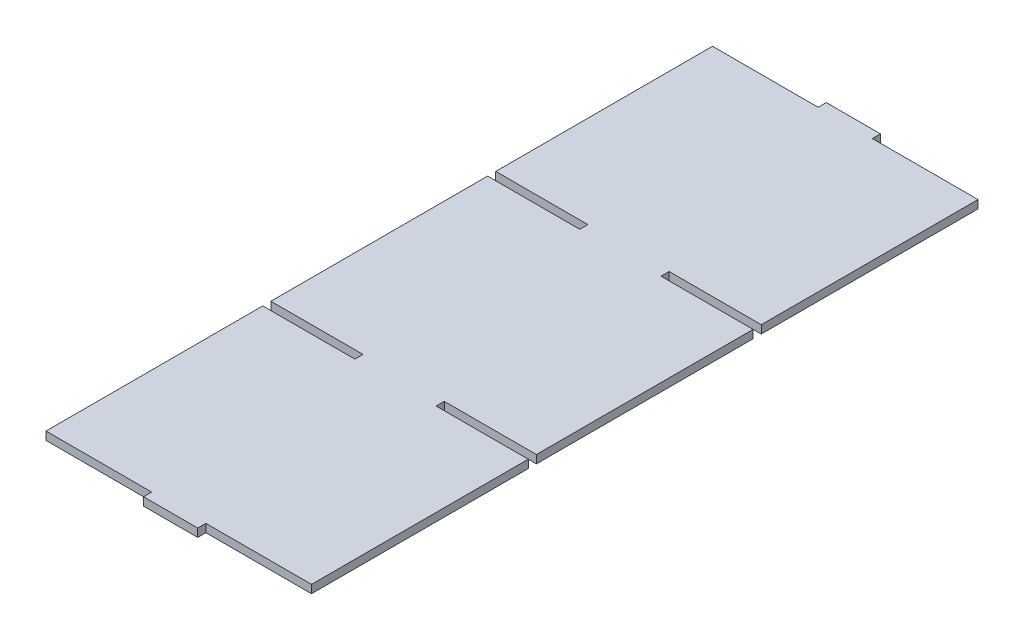
ISO-10303-21;
HEADER;
FILE_DESCRIPTION(('STEP AP214'),'2;1');
FILE_NAME('part.step','',(''),(''),'','','');
FILE_SCHEMA(('AUTOMOTIVE_DESIGN { 1 0 10303 214 1 1 1 1 }'));
ENDSEC;
DATA;
#1=APPLICATION_CONTEXT('core data for automotive mechanical design processes');
#2=APPLICATION_PROTOCOL_DEFINITION('international standard','automotive_design',2000,#1);
#3=PRODUCT_CONTEXT('',#1,'mechanical');
#4=PRODUCT('Part','Part','',(#3));
#5=PRODUCT_RELATED_PRODUCT_CATEGORY('part','',(#4));
#6=PRODUCT_DEFINITION_FORMATION('','',#4);
#7=PRODUCT_DEFINITION_CONTEXT('part definition',#1,'design');
#8=PRODUCT_DEFINITION('design','',#6,#7);
#9=PRODUCT_DEFINITION_SHAPE('','',#8);
#10=(LENGTH_UNIT() NAMED_UNIT(*) SI_UNIT(.MILLI.,.METRE.));
#11=(NAMED_UNIT(*) PLANE_ANGLE_UNIT() SI_UNIT($,.RADIAN.));
#12=(NAMED_UNIT(*) SI_UNIT($,.STERADIAN.) SOLID_ANGLE_UNIT());
#13=UNCERTAINTY_MEASURE_WITH_UNIT(LENGTH_MEASURE(1.E-05),#10,'distance_accuracy_value','');
#14=(GEOMETRIC_REPRESENTATION_CONTEXT(3) GLOBAL_UNCERTAINTY_ASSIGNED_CONTEXT((#13)) GLOBAL_UNIT_ASSIGNED_CONTEXT((#10,
#11,#12)) REPRESENTATION_CONTEXT('',''));
#15=CARTESIAN_POINT('',(0.,0.,0.));
#16=DIRECTION('',(0.,0.,1.));
#17=DIRECTION('',(1.,0.,0.));
#18=AXIS2_PLACEMENT_3D('',#15,#16,#17);
#19=CARTESIAN_POINT('',(25.,3.,-83.));
#20=DIRECTION('',(0.,0.,-1.));
#21=DIRECTION('',(-1.,0.,0.));
#22=AXIS2_PLACEMENT_3D('',#19,#20,#21);
#23=PLANE('',#22);
#24=DIRECTION('',(1.,0.,0.));
#25=VECTOR('',#24,1.);
#26=CARTESIAN_POINT('',(25.,0.,-83.));
#27=LINE('',#26,#25);
#28=CARTESIAN_POINT('',(25.,0.,-83.));
#29=VERTEX_POINT('',#28);
#30=CARTESIAN_POINT('',(59.,0.,-83.));
#31=VERTEX_POINT('',#30);
#32=EDGE_CURVE('E254',#29,#31,#27,.T.);
#33=ORIENTED_EDGE('',*,*,#32,.F.);
#34=DIRECTION('',(0.,-1.,0.));
#35=VECTOR('',#34,1.);
#36=CARTESIAN_POINT('',(25.,3.,-83.));
#37=LINE('',#36,#35);
#38=CARTESIAN_POINT('',(25.,3.,-83.));
#39=VERTEX_POINT('',#38);
#40=EDGE_CURVE('E11',#39,#29,#37,.T.);
#41=ORIENTED_EDGE('',*,*,#40,.F.);
#42=DIRECTION('',(1.,0.,0.));
#43=VECTOR('',#42,1.);
#44=CARTESIAN_POINT('',(25.,3.,-83.));
#45=LINE('',#44,#43);
#46=CARTESIAN_POINT('',(59.,3.,-83.));
#47=VERTEX_POINT('',#46);
#48=EDGE_CURVE('E334',#39,#47,#45,.T.);
#49=ORIENTED_EDGE('',*,*,#48,.T.);
#50=DIRECTION('',(0.,-1.,0.));
#51=VECTOR('',#50,1.);
#52=CARTESIAN_POINT('',(59.,3.,-83.));
#53=LINE('',#52,#51);
#54=EDGE_CURVE('E40',#47,#31,#53,.T.);
#55=ORIENTED_EDGE('',*,*,#54,.T.);
#56=EDGE_LOOP('',(#33,#41,#49,#55));
#57=FACE_BOUND('',#56,.T.);
#58=ADVANCED_FACE('F37',(#57),#23,.T.);
#59=CARTESIAN_POINT('',(25.,3.,-86.));
#60=DIRECTION('',(1.,0.,0.));
#61=DIRECTION('',(0.,0.,-1.));
#62=AXIS2_PLACEMENT_3D('',#59,#60,#61);
#63=PLANE('',#62);
#64=DIRECTION('',(0.,0.,1.));
#65=VECTOR('',#64,1.);
#66=CARTESIAN_POINT('',(25.,0.,-86.));
#67=LINE('',#66,#65);
#68=CARTESIAN_POINT('',(25.,0.,-86.));
#69=VERTEX_POINT('',#68);
#70=EDGE_CURVE('E332',#69,#29,#67,.T.);
#71=ORIENTED_EDGE('',*,*,#70,.F.);
#72=DIRECTION('',(0.,-1.,0.));
#73=VECTOR('',#72,1.);
#74=CARTESIAN_POINT('',(25.,3.,-86.));
#75=LINE('',#74,#73);
#76=CARTESIAN_POINT('',(25.,3.,-86.));
#77=VERTEX_POINT('',#76);
#78=EDGE_CURVE('E46',#77,#69,#75,.T.);
#79=ORIENTED_EDGE('',*,*,#78,.F.);
#80=DIRECTION('',(0.,0.,1.));
#81=VECTOR('',#80,1.);
#82=CARTESIAN_POINT('',(25.,3.,-86.));
#83=LINE('',#82,#81);
#84=EDGE_CURVE('E244',#77,#39,#83,.T.);
#85=ORIENTED_EDGE('',*,*,#84,.T.);
#86=ORIENTED_EDGE('',*,*,#40,.T.);
#87=EDGE_LOOP('',(#71,#79,#85,#86));
#88=FACE_BOUND('',#87,.T.);
#89=ADVANCED_FACE('F386',(#88),#63,.T.);
#90=CARTESIAN_POINT('',(59.,3.,-86.));
#91=DIRECTION('',(0.,0.,1.));
#92=DIRECTION('',(1.,0.,0.));
#93=AXIS2_PLACEMENT_3D('',#90,#91,#92);
#94=PLANE('',#93);
#95=DIRECTION('',(-1.,0.,0.));
#96=VECTOR('',#95,1.);
#97=CARTESIAN_POINT('',(59.,0.,-86.));
#98=LINE('',#97,#96);
#99=CARTESIAN_POINT('',(59.,0.,-86.));
#100=VERTEX_POINT('',#99);
#101=EDGE_CURVE('E231',#100,#69,#98,.T.);
#102=ORIENTED_EDGE('',*,*,#101,.F.);
#103=DIRECTION('',(0.,-1.,0.));
#104=VECTOR('',#103,1.);
#105=CARTESIAN_POINT('',(59.,3.,-86.));
#106=LINE('',#105,#104);
#107=CARTESIAN_POINT('',(59.,3.,-86.));
#108=VERTEX_POINT('',#107);
#109=EDGE_CURVE('E226',#108,#100,#106,.T.);
#110=ORIENTED_EDGE('',*,*,#109,.F.);
#111=DIRECTION('',(-1.,0.,0.));
#112=VECTOR('',#111,1.);
#113=CARTESIAN_POINT('',(59.,3.,-86.));
#114=LINE('',#113,#112);
#115=EDGE_CURVE('E229',#108,#77,#114,.T.);
#116=ORIENTED_EDGE('',*,*,#115,.T.);
#117=ORIENTED_EDGE('',*,*,#78,.T.);
#118=EDGE_LOOP('',(#102,#110,#116,#117));
#119=FACE_BOUND('',#118,.T.);
#120=ADVANCED_FACE('F228',(#119),#94,.T.);
#121=CARTESIAN_POINT('',(59.,3.,-166.));
#122=DIRECTION('',(1.,0.,0.));
#123=DIRECTION('',(0.,0.,-1.));
#124=AXIS2_PLACEMENT_3D('',#121,#122,#123);
#125=PLANE('',#124);
#126=DIRECTION('',(0.,0.,1.));
#127=VECTOR('',#126,1.);
#128=CARTESIAN_POINT('',(59.,0.,-166.));
#129=LINE('',#128,#127);
#130=CARTESIAN_POINT('',(59.,0.,-166.));
#131=VERTEX_POINT('',#130);
#132=EDGE_CURVE('E329',#131,#100,#129,.T.);
#133=ORIENTED_EDGE('',*,*,#132,.F.);
#134=DIRECTION('',(0.,-1.,0.));
#135=VECTOR('',#134,1.);
#136=CARTESIAN_POINT('',(59.,3.,-166.));
#137=LINE('',#136,#135);
#138=CARTESIAN_POINT('',(59.,3.,-166.));
#139=VERTEX_POINT('',#138);
#140=EDGE_CURVE('E236',#139,#131,#137,.T.);
#141=ORIENTED_EDGE('',*,*,#140,.F.);
#142=DIRECTION('',(0.,0.,1.));
#143=VECTOR('',#142,1.);
#144=CARTESIAN_POINT('',(59.,3.,-166.));
#145=LINE('',#144,#143);
#146=EDGE_CURVE('E242',#139,#108,#145,.T.);
#147=ORIENTED_EDGE('',*,*,#146,.T.);
#148=ORIENTED_EDGE('',*,*,#109,.T.);
#149=EDGE_LOOP('',(#133,#141,#147,#148));
#150=FACE_BOUND('',#149,.T.);
#151=ADVANCED_FACE('F246',(#150),#125,.T.);
#152=CARTESIAN_POINT('',(25.,3.,-166.));
#153=DIRECTION('',(0.,0.,-1.));
#154=DIRECTION('',(-1.,0.,0.));
#155=AXIS2_PLACEMENT_3D('',#152,#153,#154);
#156=PLANE('',#155);
#157=DIRECTION('',(1.,0.,0.));
#158=VECTOR('',#157,1.);
#159=CARTESIAN_POINT('',(25.,0.,-166.));
#160=LINE('',#159,#158);
#161=CARTESIAN_POINT('',(25.,0.,-166.));
#162=VERTEX_POINT('',#161);
#163=EDGE_CURVE('E326',#162,#131,#160,.T.);
#164=ORIENTED_EDGE('',*,*,#163,.F.);
#165=DIRECTION('',(0.,-1.,0.));
#166=VECTOR('',#165,1.);
#167=CARTESIAN_POINT('',(25.,3.,-166.));
#168=LINE('',#167,#166);
#169=CARTESIAN_POINT('',(25.,3.,-166.));
#170=VERTEX_POINT('',#169);
#171=EDGE_CURVE('E338',#170,#162,#168,.T.);
#172=ORIENTED_EDGE('',*,*,#171,.F.);
#173=DIRECTION('',(1.,0.,0.));
#174=VECTOR('',#173,1.);
#175=CARTESIAN_POINT('',(25.,3.,-166.));
#176=LINE('',#175,#174);
#177=EDGE_CURVE('E247',#170,#139,#176,.T.);
#178=ORIENTED_EDGE('',*,*,#177,.T.);
#179=ORIENTED_EDGE('',*,*,#140,.T.);
#180=EDGE_LOOP('',(#164,#172,#178,#179));
#181=FACE_BOUND('',#180,.T.);
#182=ADVANCED_FACE('F399',(#181),#156,.T.);
#183=CARTESIAN_POINT('',(25.,3.,-169.));
#184=DIRECTION('',(1.,0.,0.));
#185=DIRECTION('',(0.,0.,-1.));
#186=AXIS2_PLACEMENT_3D('',#183,#184,#185);
#187=PLANE('',#186);
#188=DIRECTION('',(0.,0.,1.));
#189=VECTOR('',#188,1.);
#190=CARTESIAN_POINT('',(25.,0.,-169.));
#191=LINE('',#190,#189);
#192=CARTESIAN_POINT('',(25.,0.,-169.));
#193=VERTEX_POINT('',#192);
#194=EDGE_CURVE('E323',#193,#162,#191,.T.);
#195=ORIENTED_EDGE('',*,*,#194,.F.);
#196=DIRECTION('',(0.,-1.,0.));
#197=VECTOR('',#196,1.);
#198=CARTESIAN_POINT('',(25.,3.,-169.));
#199=LINE('',#198,#197);
#200=CARTESIAN_POINT('',(25.,3.,-169.));
#201=VERTEX_POINT('',#200);
#202=EDGE_CURVE('E340',#201,#193,#199,.T.);
#203=ORIENTED_EDGE('',*,*,#202,.F.);
#204=DIRECTION('',(0.,0.,1.));
#205=VECTOR('',#204,1.);
#206=CARTESIAN_POINT('',(25.,3.,-169.));
#207=LINE('',#206,#205);
#208=EDGE_CURVE('E249',#201,#170,#207,.T.);
#209=ORIENTED_EDGE('',*,*,#208,.T.);
#210=ORIENTED_EDGE('',*,*,#171,.T.);
#211=EDGE_LOOP('',(#195,#203,#209,#210));
#212=FACE_BOUND('',#211,.T.);
#213=ADVANCED_FACE('F402',(#212),#187,.T.);
#214=CARTESIAN_POINT('',(59.,3.,-169.));
#215=DIRECTION('',(0.,0.,1.));
#216=DIRECTION('',(1.,0.,0.));
#217=AXIS2_PLACEMENT_3D('',#214,#215,#216);
#218=PLANE('',#217);
#219=DIRECTION('',(-1.,0.,0.));
#220=VECTOR('',#219,1.);
#221=CARTESIAN_POINT('',(59.,0.,-169.));
#222=LINE('',#221,#220);
#223=CARTESIAN_POINT('',(59.,0.,-169.));
#224=VERTEX_POINT('',#223);
#225=EDGE_CURVE('E320',#224,#193,#222,.T.);
#226=ORIENTED_EDGE('',*,*,#225,.F.);
#227=DIRECTION('',(0.,-1.,0.));
#228=VECTOR('',#227,1.);
#229=CARTESIAN_POINT('',(59.,3.,-169.));
#230=LINE('',#229,#228);
#231=CARTESIAN_POINT('',(59.,3.,-169.));
#232=VERTEX_POINT('',#231);
#233=EDGE_CURVE('E342',#232,#224,#230,.T.);
#234=ORIENTED_EDGE('',*,*,#233,.F.);
#235=DIRECTION('',(-1.,0.,0.));
#236=VECTOR('',#235,1.);
#237=CARTESIAN_POINT('',(59.,3.,-169.));
#238=LINE('',#237,#236);
#239=EDGE_CURVE('E807',#232,#201,#238,.T.);
#240=ORIENTED_EDGE('',*,*,#239,.T.);
#241=ORIENTED_EDGE('',*,*,#202,.T.);
#242=EDGE_LOOP('',(#226,#234,#240,#241));
#243=FACE_BOUND('',#242,.T.);
#244=ADVANCED_FACE('F406',(#243),#218,.T.);
#245=CARTESIAN_POINT('',(59.,3.,-249.));
#246=DIRECTION('',(1.,0.,0.));
#247=DIRECTION('',(0.,0.,-1.));
#248=AXIS2_PLACEMENT_3D('',#245,#246,#247);
#249=PLANE('',#248);
#250=DIRECTION('',(0.,0.,1.));
#251=VECTOR('',#250,1.);
#252=CARTESIAN_POINT('',(59.,0.,-249.));
#253=LINE('',#252,#251);
#254=CARTESIAN_POINT('',(59.,0.,-249.));
#255=VERTEX_POINT('',#254);
#256=EDGE_CURVE('E317',#255,#224,#253,.T.);
#257=ORIENTED_EDGE('',*,*,#256,.F.);
#258=DIRECTION('',(0.,-1.,0.));
#259=VECTOR('',#258,1.);
#260=CARTESIAN_POINT('',(59.,3.,-249.));
#261=LINE('',#260,#259);
#262=CARTESIAN_POINT('',(59.,3.,-249.));
#263=VERTEX_POINT('',#262);
#264=EDGE_CURVE('E344',#263,#255,#261,.T.);
#265=ORIENTED_EDGE('',*,*,#264,.F.);
#266=DIRECTION('',(0.,0.,1.));
#267=VECTOR('',#266,1.);
#268=CARTESIAN_POINT('',(59.,3.,-249.));
#269=LINE('',#268,#267);
#270=EDGE_CURVE('E803',#263,#232,#269,.T.);
#271=ORIENTED_EDGE('',*,*,#270,.T.);
#272=ORIENTED_EDGE('',*,*,#233,.T.);
#273=EDGE_LOOP('',(#257,#265,#271,#272));
#274=FACE_BOUND('',#273,.T.);
#275=ADVANCED_FACE('F410',(#274),#249,.T.);
#276=CARTESIAN_POINT('',(20.,3.,-249.));
#277=DIRECTION('',(0.,0.,-1.));
#278=DIRECTION('',(-1.,0.,0.));
#279=AXIS2_PLACEMENT_3D('',#276,#277,#278);
#280=PLANE('',#279);
#281=DIRECTION('',(1.,0.,0.));
#282=VECTOR('',#281,1.);
#283=CARTESIAN_POINT('',(20.,0.,-249.));
#284=LINE('',#283,#282);
#285=CARTESIAN_POINT('',(20.,0.,-249.));
#286=VERTEX_POINT('',#285);
#287=EDGE_CURVE('E314',#286,#255,#284,.T.);
#288=ORIENTED_EDGE('',*,*,#287,.F.);
#289=DIRECTION('',(0.,-1.,0.));
#290=VECTOR('',#289,1.);
#291=CARTESIAN_POINT('',(20.,3.,-249.));
#292=LINE('',#291,#290);
#293=CARTESIAN_POINT('',(20.,3.,-249.));
#294=VERTEX_POINT('',#293);
#295=EDGE_CURVE('E346',#294,#286,#292,.T.);
#296=ORIENTED_EDGE('',*,*,#295,.F.);
#297=DIRECTION('',(1.,0.,0.));
#298=VECTOR('',#297,1.);
#299=CARTESIAN_POINT('',(20.,3.,-249.));
#300=LINE('',#299,#298);
#301=EDGE_CURVE('E814',#294,#263,#300,.T.);
#302=ORIENTED_EDGE('',*,*,#301,.T.);
#303=ORIENTED_EDGE('',*,*,#264,.T.);
#304=EDGE_LOOP('',(#288,#296,#302,#303));
#305=FACE_BOUND('',#304,.T.);
#306=ADVANCED_FACE('F414',(#305),#280,.T.);
#307=CARTESIAN_POINT('',(20.,3.,-252.));
#308=DIRECTION('',(1.,0.,0.));
#309=DIRECTION('',(0.,0.,-1.));
#310=AXIS2_PLACEMENT_3D('',#307,#308,#309);
#311=PLANE('',#310);
#312=DIRECTION('',(0.,0.,1.));
#313=VECTOR('',#312,1.);
#314=CARTESIAN_POINT('',(20.,0.,-252.));
#315=LINE('',#314,#313);
#316=CARTESIAN_POINT('',(20.,0.,-252.));
#317=VERTEX_POINT('',#316);
#318=EDGE_CURVE('E311',#317,#286,#315,.T.);
#319=ORIENTED_EDGE('',*,*,#318,.F.);
#320=DIRECTION('',(0.,-1.,0.));
#321=VECTOR('',#320,1.);
#322=CARTESIAN_POINT('',(20.,3.,-252.));
#323=LINE('',#322,#321);
#324=CARTESIAN_POINT('',(20.,3.,-252.));
#325=VERTEX_POINT('',#324);
#326=EDGE_CURVE('E348',#325,#317,#323,.T.);
#327=ORIENTED_EDGE('',*,*,#326,.F.);
#328=DIRECTION('',(0.,0.,1.));
#329=VECTOR('',#328,1.);
#330=CARTESIAN_POINT('',(20.,3.,-252.));
#331=LINE('',#330,#329);
#332=EDGE_CURVE('E796',#325,#294,#331,.T.);
#333=ORIENTED_EDGE('',*,*,#332,.T.);
#334=ORIENTED_EDGE('',*,*,#295,.T.);
#335=EDGE_LOOP('',(#319,#327,#333,#334));
#336=FACE_BOUND('',#335,.T.);
#337=ADVANCED_FACE('F418',(#336),#311,.T.);
#338=CARTESIAN_POINT('',(0.,3.,-252.));
#339=DIRECTION('',(0.,0.,-1.));
#340=DIRECTION('',(-1.,0.,0.));
#341=AXIS2_PLACEMENT_3D('',#338,#339,#340);
#342=PLANE('',#341);
#343=DIRECTION('',(1.,0.,0.));
#344=VECTOR('',#343,1.);
#345=CARTESIAN_POINT('',(0.,0.,-252.));
#346=LINE('',#345,#344);
#347=CARTESIAN_POINT('',(0.,0.,-252.));
#348=VERTEX_POINT('',#347);
#349=EDGE_CURVE('E308',#348,#317,#346,.T.);
#350=ORIENTED_EDGE('',*,*,#349,.F.);
#351=DIRECTION('',(0.,-1.,0.));
#352=VECTOR('',#351,1.);
#353=CARTESIAN_POINT('',(0.,3.,-252.));
#354=LINE('',#353,#352);
#355=CARTESIAN_POINT('',(0.,3.,-252.));
#356=VERTEX_POINT('',#355);
#357=EDGE_CURVE('E350',#356,#348,#354,.T.);
#358=ORIENTED_EDGE('',*,*,#357,.F.);
#359=DIRECTION('',(1.,0.,0.));
#360=VECTOR('',#359,1.);
#361=CARTESIAN_POINT('',(0.,3.,-252.));
#362=LINE('',#361,#360);
#363=EDGE_CURVE('E792',#356,#325,#362,.T.);
#364=ORIENTED_EDGE('',*,*,#363,.T.);
#365=ORIENTED_EDGE('',*,*,#326,.T.);
#366=EDGE_LOOP('',(#350,#358,#364,#365));
#367=FACE_BOUND('',#366,.T.);
#368=ADVANCED_FACE('F422',(#367),#342,.T.);
#369=CARTESIAN_POINT('',(0.,3.,-249.));
#370=DIRECTION('',(-1.,0.,0.));
#371=DIRECTION('',(0.,0.,1.));
#372=AXIS2_PLACEMENT_3D('',#369,#370,#371);
#373=PLANE('',#372);
#374=DIRECTION('',(0.,0.,-1.));
#375=VECTOR('',#374,1.);
#376=CARTESIAN_POINT('',(0.,0.,-249.));
#377=LINE('',#376,#375);
#378=CARTESIAN_POINT('',(0.,0.,-249.));
#379=VERTEX_POINT('',#378);
#380=EDGE_CURVE('E305',#379,#348,#377,.T.);
#381=ORIENTED_EDGE('',*,*,#380,.F.);
#382=DIRECTION('',(0.,-1.,0.));
#383=VECTOR('',#382,1.);
#384=CARTESIAN_POINT('',(0.,3.,-249.));
#385=LINE('',#384,#383);
#386=CARTESIAN_POINT('',(0.,3.,-249.));
#387=VERTEX_POINT('',#386);
#388=EDGE_CURVE('E352',#387,#379,#385,.T.);
#389=ORIENTED_EDGE('',*,*,#388,.F.);
#390=DIRECTION('',(0.,0.,-1.));
#391=VECTOR('',#390,1.);
#392=CARTESIAN_POINT('',(0.,3.,-249.));
#393=LINE('',#392,#391);
#394=EDGE_CURVE('E818',#387,#356,#393,.T.);
#395=ORIENTED_EDGE('',*,*,#394,.T.);
#396=ORIENTED_EDGE('',*,*,#357,.T.);
#397=EDGE_LOOP('',(#381,#389,#395,#396));
#398=FACE_BOUND('',#397,.T.);
#399=ADVANCED_FACE('F426',(#398),#373,.T.);
#400=CARTESIAN_POINT('',(-39.,3.,-249.));
#401=DIRECTION('',(0.,0.,-1.));
#402=DIRECTION('',(-1.,0.,0.));
#403=AXIS2_PLACEMENT_3D('',#400,#401,#402);
#404=PLANE('',#403);
#405=DIRECTION('',(1.,0.,0.));
#406=VECTOR('',#405,1.);
#407=CARTESIAN_POINT('',(-39.,0.,-249.));
#408=LINE('',#407,#406);
#409=CARTESIAN_POINT('',(-39.,0.,-249.));
#410=VERTEX_POINT('',#409);
#411=EDGE_CURVE('E302',#410,#379,#408,.T.);
#412=ORIENTED_EDGE('',*,*,#411,.F.);
#413=DIRECTION('',(0.,-1.,0.));
#414=VECTOR('',#413,1.);
#415=CARTESIAN_POINT('',(-39.,3.,-249.));
#416=LINE('',#415,#414);
#417=CARTESIAN_POINT('',(-39.,3.,-249.));
#418=VERTEX_POINT('',#417);
#419=EDGE_CURVE('E354',#418,#410,#416,.T.);
#420=ORIENTED_EDGE('',*,*,#419,.F.);
#421=DIRECTION('',(1.,0.,0.));
#422=VECTOR('',#421,1.);
#423=CARTESIAN_POINT('',(-39.,3.,-249.));
#424=LINE('',#423,#422);
#425=EDGE_CURVE('E785',#418,#387,#424,.T.);
#426=ORIENTED_EDGE('',*,*,#425,.T.);
#427=ORIENTED_EDGE('',*,*,#388,.T.);
#428=EDGE_LOOP('',(#412,#420,#426,#427));
#429=FACE_BOUND('',#428,.T.);
#430=ADVANCED_FACE('F430',(#429),#404,.T.);
#431=CARTESIAN_POINT('',(-39.,3.,-169.));
#432=DIRECTION('',(-1.,0.,0.));
#433=DIRECTION('',(0.,0.,1.));
#434=AXIS2_PLACEMENT_3D('',#431,#432,#433);
#435=PLANE('',#434);
#436=DIRECTION('',(0.,0.,-1.));
#437=VECTOR('',#436,1.);
#438=CARTESIAN_POINT('',(-39.,0.,-169.));
#439=LINE('',#438,#437);
#440=CARTESIAN_POINT('',(-39.,0.,-169.));
#441=VERTEX_POINT('',#440);
#442=EDGE_CURVE('E299',#441,#410,#439,.T.);
#443=ORIENTED_EDGE('',*,*,#442,.F.);
#444=DIRECTION('',(0.,-1.,0.));
#445=VECTOR('',#444,1.);
#446=CARTESIAN_POINT('',(-39.,3.,-169.));
#447=LINE('',#446,#445);
#448=CARTESIAN_POINT('',(-39.,3.,-169.));
#449=VERTEX_POINT('',#448);
#450=EDGE_CURVE('E356',#449,#441,#447,.T.);
#451=ORIENTED_EDGE('',*,*,#450,.F.);
#452=DIRECTION('',(0.,0.,-1.));
#453=VECTOR('',#452,1.);
#454=CARTESIAN_POINT('',(-39.,3.,-169.));
#455=LINE('',#454,#453);
#456=EDGE_CURVE('E781',#449,#418,#455,.T.);
#457=ORIENTED_EDGE('',*,*,#456,.T.);
#458=ORIENTED_EDGE('',*,*,#419,.T.);
#459=EDGE_LOOP('',(#443,#451,#457,#458));
#460=FACE_BOUND('',#459,.T.);
#461=ADVANCED_FACE('F434',(#460),#435,.T.);
#462=CARTESIAN_POINT('',(-5.,3.,-169.));
#463=DIRECTION('',(0.,0.,1.));
#464=DIRECTION('',(1.,0.,0.));
#465=AXIS2_PLACEMENT_3D('',#462,#463,#464);
#466=PLANE('',#465);
#467=DIRECTION('',(-1.,0.,0.));
#468=VECTOR('',#467,1.);
#469=CARTESIAN_POINT('',(-5.,0.,-169.));
#470=LINE('',#469,#468);
#471=CARTESIAN_POINT('',(-5.,0.,-169.));
#472=VERTEX_POINT('',#471);
#473=EDGE_CURVE('E296',#472,#441,#470,.T.);
#474=ORIENTED_EDGE('',*,*,#473,.F.);
#475=DIRECTION('',(0.,-1.,0.));
#476=VECTOR('',#475,1.);
#477=CARTESIAN_POINT('',(-5.,3.,-169.));
#478=LINE('',#477,#476);
#479=CARTESIAN_POINT('',(-5.,3.,-169.));
#480=VERTEX_POINT('',#479);
#481=EDGE_CURVE('E358',#480,#472,#478,.T.);
#482=ORIENTED_EDGE('',*,*,#481,.F.);
#483=DIRECTION('',(-1.,0.,0.));
#484=VECTOR('',#483,1.);
#485=CARTESIAN_POINT('',(-5.,3.,-169.));
#486=LINE('',#485,#484);
#487=EDGE_CURVE('E822',#480,#449,#486,.T.);
#488=ORIENTED_EDGE('',*,*,#487,.T.);
#489=ORIENTED_EDGE('',*,*,#450,.T.);
#490=EDGE_LOOP('',(#474,#482,#488,#489));
#491=FACE_BOUND('',#490,.T.);
#492=ADVANCED_FACE('F438',(#491),#466,.T.);
#493=CARTESIAN_POINT('',(-5.,3.,-166.));
#494=DIRECTION('',(-1.,0.,0.));
#495=DIRECTION('',(0.,0.,1.));
#496=AXIS2_PLACEMENT_3D('',#493,#494,#495);
#497=PLANE('',#496);
#498=DIRECTION('',(0.,0.,-1.));
#499=VECTOR('',#498,1.);
#500=CARTESIAN_POINT('',(-5.,0.,-166.));
#501=LINE('',#500,#499);
#502=CARTESIAN_POINT('',(-5.,0.,-166.));
#503=VERTEX_POINT('',#502);
#504=EDGE_CURVE('E293',#503,#472,#501,.T.);
#505=ORIENTED_EDGE('',*,*,#504,.F.);
#506=DIRECTION('',(0.,-1.,0.));
#507=VECTOR('',#506,1.);
#508=CARTESIAN_POINT('',(-5.,3.,-166.));
#509=LINE('',#508,#507);
#510=CARTESIAN_POINT('',(-5.,3.,-166.));
#511=VERTEX_POINT('',#510);
#512=EDGE_CURVE('E360',#511,#503,#509,.T.);
#513=ORIENTED_EDGE('',*,*,#512,.F.);
#514=DIRECTION('',(0.,0.,-1.));
#515=VECTOR('',#514,1.);
#516=CARTESIAN_POINT('',(-5.,3.,-166.));
#517=LINE('',#516,#515);
#518=EDGE_CURVE('E774',#511,#480,#517,.T.);
#519=ORIENTED_EDGE('',*,*,#518,.T.);
#520=ORIENTED_EDGE('',*,*,#481,.T.);
#521=EDGE_LOOP('',(#505,#513,#519,#520));
#522=FACE_BOUND('',#521,.T.);
#523=ADVANCED_FACE('F442',(#522),#497,.T.);
#524=CARTESIAN_POINT('',(-39.,3.,-166.));
#525=DIRECTION('',(0.,0.,-1.));
#526=DIRECTION('',(-1.,0.,0.));
#527=AXIS2_PLACEMENT_3D('',#524,#525,#526);
#528=PLANE('',#527);
#529=DIRECTION('',(1.,0.,0.));
#530=VECTOR('',#529,1.);
#531=CARTESIAN_POINT('',(-39.,0.,-166.));
#532=LINE('',#531,#530);
#533=CARTESIAN_POINT('',(-39.,0.,-166.));
#534=VERTEX_POINT('',#533);
#535=EDGE_CURVE('E290',#534,#503,#532,.T.);
#536=ORIENTED_EDGE('',*,*,#535,.F.);
#537=DIRECTION('',(0.,-1.,0.));
#538=VECTOR('',#537,1.);
#539=CARTESIAN_POINT('',(-39.,3.,-166.));
#540=LINE('',#539,#538);
#541=CARTESIAN_POINT('',(-39.,3.,-166.));
#542=VERTEX_POINT('',#541);
#543=EDGE_CURVE('E362',#542,#534,#540,.T.);
#544=ORIENTED_EDGE('',*,*,#543,.F.);
#545=DIRECTION('',(1.,0.,0.));
#546=VECTOR('',#545,1.);
#547=CARTESIAN_POINT('',(-39.,3.,-166.));
#548=LINE('',#547,#546);
#549=EDGE_CURVE('E770',#542,#511,#548,.T.);
#550=ORIENTED_EDGE('',*,*,#549,.T.);
#551=ORIENTED_EDGE('',*,*,#512,.T.);
#552=EDGE_LOOP('',(#536,#544,#550,#551));
#553=FACE_BOUND('',#552,.T.);
#554=ADVANCED_FACE('F446',(#553),#528,.T.);
#555=CARTESIAN_POINT('',(-39.,3.,-86.));
#556=DIRECTION('',(-1.,0.,0.));
#557=DIRECTION('',(0.,0.,1.));
#558=AXIS2_PLACEMENT_3D('',#555,#556,#557);
#559=PLANE('',#558);
#560=DIRECTION('',(0.,0.,-1.));
#561=VECTOR('',#560,1.);
#562=CARTESIAN_POINT('',(-39.,0.,-86.));
#563=LINE('',#562,#561);
#564=CARTESIAN_POINT('',(-39.,0.,-86.));
#565=VERTEX_POINT('',#564);
#566=EDGE_CURVE('E287',#565,#534,#563,.T.);
#567=ORIENTED_EDGE('',*,*,#566,.F.);
#568=DIRECTION('',(0.,-1.,0.));
#569=VECTOR('',#568,1.);
#570=CARTESIAN_POINT('',(-39.,3.,-86.));
#571=LINE('',#570,#569);
#572=CARTESIAN_POINT('',(-39.,3.,-86.));
#573=VERTEX_POINT('',#572);
#574=EDGE_CURVE('E364',#573,#565,#571,.T.);
#575=ORIENTED_EDGE('',*,*,#574,.F.);
#576=DIRECTION('',(0.,0.,-1.));
#577=VECTOR('',#576,1.);
#578=CARTESIAN_POINT('',(-39.,3.,-86.));
#579=LINE('',#578,#577);
#580=EDGE_CURVE('E826',#573,#542,#579,.T.);
#581=ORIENTED_EDGE('',*,*,#580,.T.);
#582=ORIENTED_EDGE('',*,*,#543,.T.);
#583=EDGE_LOOP('',(#567,#575,#581,#582));
#584=FACE_BOUND('',#583,.T.);
#585=ADVANCED_FACE('F450',(#584),#559,.T.);
#586=CARTESIAN_POINT('',(-5.,3.,-86.));
#587=DIRECTION('',(0.,0.,1.));
#588=DIRECTION('',(1.,0.,0.));
#589=AXIS2_PLACEMENT_3D('',#586,#587,#588);
#590=PLANE('',#589);
#591=DIRECTION('',(-1.,0.,0.));
#592=VECTOR('',#591,1.);
#593=CARTESIAN_POINT('',(-5.,0.,-86.));
#594=LINE('',#593,#592);
#595=CARTESIAN_POINT('',(-5.,0.,-86.));
#596=VERTEX_POINT('',#595);
#597=EDGE_CURVE('E284',#596,#565,#594,.T.);
#598=ORIENTED_EDGE('',*,*,#597,.F.);
#599=DIRECTION('',(0.,-1.,0.));
#600=VECTOR('',#599,1.);
#601=CARTESIAN_POINT('',(-5.,3.,-86.));
#602=LINE('',#601,#600);
#603=CARTESIAN_POINT('',(-5.,3.,-86.));
#604=VERTEX_POINT('',#603);
#605=EDGE_CURVE('E366',#604,#596,#602,.T.);
#606=ORIENTED_EDGE('',*,*,#605,.F.);
#607=DIRECTION('',(-1.,0.,0.));
#608=VECTOR('',#607,1.);
#609=CARTESIAN_POINT('',(-5.,3.,-86.));
#610=LINE('',#609,#608);
#611=EDGE_CURVE('E763',#604,#573,#610,.T.);
#612=ORIENTED_EDGE('',*,*,#611,.T.);
#613=ORIENTED_EDGE('',*,*,#574,.T.);
#614=EDGE_LOOP('',(#598,#606,#612,#613));
#615=FACE_BOUND('',#614,.T.);
#616=ADVANCED_FACE('F454',(#615),#590,.T.);
#617=CARTESIAN_POINT('',(-5.,3.,-83.));
#618=DIRECTION('',(-1.,0.,0.));
#619=DIRECTION('',(0.,0.,1.));
#620=AXIS2_PLACEMENT_3D('',#617,#618,#619);
#621=PLANE('',#620);
#622=DIRECTION('',(0.,0.,-1.));
#623=VECTOR('',#622,1.);
#624=CARTESIAN_POINT('',(-5.,0.,-83.));
#625=LINE('',#624,#623);
#626=CARTESIAN_POINT('',(-5.,0.,-83.));
#627=VERTEX_POINT('',#626);
#628=EDGE_CURVE('E281',#627,#596,#625,.T.);
#629=ORIENTED_EDGE('',*,*,#628,.F.);
#630=DIRECTION('',(0.,-1.,0.));
#631=VECTOR('',#630,1.);
#632=CARTESIAN_POINT('',(-5.,3.,-83.));
#633=LINE('',#632,#631);
#634=CARTESIAN_POINT('',(-5.,3.,-83.));
#635=VERTEX_POINT('',#634);
#636=EDGE_CURVE('E368',#635,#627,#633,.T.);
#637=ORIENTED_EDGE('',*,*,#636,.F.);
#638=DIRECTION('',(0.,0.,-1.));
#639=VECTOR('',#638,1.);
#640=CARTESIAN_POINT('',(-5.,3.,-83.));
#641=LINE('',#640,#639);
#642=EDGE_CURVE('E759',#635,#604,#641,.T.);
#643=ORIENTED_EDGE('',*,*,#642,.T.);
#644=ORIENTED_EDGE('',*,*,#605,.T.);
#645=EDGE_LOOP('',(#629,#637,#643,#644));
#646=FACE_BOUND('',#645,.T.);
#647=ADVANCED_FACE('F458',(#646),#621,.T.);
#648=CARTESIAN_POINT('',(-39.,3.,-83.));
#649=DIRECTION('',(0.,0.,-1.));
#650=DIRECTION('',(-1.,0.,0.));
#651=AXIS2_PLACEMENT_3D('',#648,#649,#650);
#652=PLANE('',#651);
#653=DIRECTION('',(1.,0.,0.));
#654=VECTOR('',#653,1.);
#655=CARTESIAN_POINT('',(-39.,0.,-83.));
#656=LINE('',#655,#654);
#657=CARTESIAN_POINT('',(-39.,0.,-83.));
#658=VERTEX_POINT('',#657);
#659=EDGE_CURVE('E278',#658,#627,#656,.T.);
#660=ORIENTED_EDGE('',*,*,#659,.F.);
#661=DIRECTION('',(0.,-1.,0.));
#662=VECTOR('',#661,1.);
#663=CARTESIAN_POINT('',(-39.,3.,-83.));
#664=LINE('',#663,#662);
#665=CARTESIAN_POINT('',(-39.,3.,-83.));
#666=VERTEX_POINT('',#665);
#667=EDGE_CURVE('E370',#666,#658,#664,.T.);
#668=ORIENTED_EDGE('',*,*,#667,.F.);
#669=DIRECTION('',(1.,0.,0.));
#670=VECTOR('',#669,1.);
#671=CARTESIAN_POINT('',(-39.,3.,-83.));
#672=LINE('',#671,#670);
#673=EDGE_CURVE('E830',#666,#635,#672,.T.);
#674=ORIENTED_EDGE('',*,*,#673,.T.);
#675=ORIENTED_EDGE('',*,*,#636,.T.);
#676=EDGE_LOOP('',(#660,#668,#674,#675));
#677=FACE_BOUND('',#676,.T.);
#678=ADVANCED_FACE('F462',(#677),#652,.T.);
#679=CARTESIAN_POINT('',(-39.,3.,-3.));
#680=DIRECTION('',(-1.,0.,0.));
#681=DIRECTION('',(0.,0.,1.));
#682=AXIS2_PLACEMENT_3D('',#679,#680,#681);
#683=PLANE('',#682);
#684=DIRECTION('',(0.,0.,-1.));
#685=VECTOR('',#684,1.);
#686=CARTESIAN_POINT('',(-39.,0.,-3.));
#687=LINE('',#686,#685);
#688=CARTESIAN_POINT('',(-39.,0.,-3.));
#689=VERTEX_POINT('',#688);
#690=EDGE_CURVE('E275',#689,#658,#687,.T.);
#691=ORIENTED_EDGE('',*,*,#690,.F.);
#692=DIRECTION('',(0.,-1.,0.));
#693=VECTOR('',#692,1.);
#694=CARTESIAN_POINT('',(-39.,3.,-3.));
#695=LINE('',#694,#693);
#696=CARTESIAN_POINT('',(-39.,3.,-3.));
#697=VERTEX_POINT('',#696);
#698=EDGE_CURVE('E372',#697,#689,#695,.T.);
#699=ORIENTED_EDGE('',*,*,#698,.F.);
#700=DIRECTION('',(0.,0.,-1.));
#701=VECTOR('',#700,1.);
#702=CARTESIAN_POINT('',(-39.,3.,-3.));
#703=LINE('',#702,#701);
#704=EDGE_CURVE('E752',#697,#666,#703,.T.);
#705=ORIENTED_EDGE('',*,*,#704,.T.);
#706=ORIENTED_EDGE('',*,*,#667,.T.);
#707=EDGE_LOOP('',(#691,#699,#705,#706));
#708=FACE_BOUND('',#707,.T.);
#709=ADVANCED_FACE('F466',(#708),#683,.T.);
#710=CARTESIAN_POINT('',(0.,3.,-3.));
#711=DIRECTION('',(0.,0.,1.));
#712=DIRECTION('',(1.,0.,0.));
#713=AXIS2_PLACEMENT_3D('',#710,#711,#712);
#714=PLANE('',#713);
#715=DIRECTION('',(-1.,0.,0.));
#716=VECTOR('',#715,1.);
#717=CARTESIAN_POINT('',(0.,0.,-3.));
#718=LINE('',#717,#716);
#719=CARTESIAN_POINT('',(0.,0.,-3.));
#720=VERTEX_POINT('',#719);
#721=EDGE_CURVE('E272',#720,#689,#718,.T.);
#722=ORIENTED_EDGE('',*,*,#721,.F.);
#723=DIRECTION('',(0.,-1.,0.));
#724=VECTOR('',#723,1.);
#725=CARTESIAN_POINT('',(0.,3.,-3.));
#726=LINE('',#725,#724);
#727=CARTESIAN_POINT('',(0.,3.,-3.));
#728=VERTEX_POINT('',#727);
#729=EDGE_CURVE('E374',#728,#720,#726,.T.);
#730=ORIENTED_EDGE('',*,*,#729,.F.);
#731=DIRECTION('',(-1.,0.,0.));
#732=VECTOR('',#731,1.);
#733=CARTESIAN_POINT('',(0.,3.,-3.));
#734=LINE('',#733,#732);
#735=EDGE_CURVE('E748',#728,#697,#734,.T.);
#736=ORIENTED_EDGE('',*,*,#735,.T.);
#737=ORIENTED_EDGE('',*,*,#698,.T.);
#738=EDGE_LOOP('',(#722,#730,#736,#737));
#739=FACE_BOUND('',#738,.T.);
#740=ADVANCED_FACE('F470',(#739),#714,.T.);
#741=CARTESIAN_POINT('',(0.,3.,0.));
#742=DIRECTION('',(-1.,0.,0.));
#743=DIRECTION('',(0.,0.,1.));
#744=AXIS2_PLACEMENT_3D('',#741,#742,#743);
#745=PLANE('',#744);
#746=DIRECTION('',(0.,0.,-1.));
#747=VECTOR('',#746,1.);
#748=CARTESIAN_POINT('',(0.,0.,0.));
#749=LINE('',#748,#747);
#750=CARTESIAN_POINT('',(0.,0.,0.));
#751=VERTEX_POINT('',#750);
#752=EDGE_CURVE('E269',#751,#720,#749,.T.);
#753=ORIENTED_EDGE('',*,*,#752,.F.);
#754=DIRECTION('',(0.,-1.,0.));
#755=VECTOR('',#754,1.);
#756=CARTESIAN_POINT('',(0.,3.,0.));
#757=LINE('',#756,#755);
#758=CARTESIAN_POINT('',(0.,3.,0.));
#759=VERTEX_POINT('',#758);
#760=EDGE_CURVE('E376',#759,#751,#757,.T.);
#761=ORIENTED_EDGE('',*,*,#760,.F.);
#762=DIRECTION('',(0.,0.,-1.));
#763=VECTOR('',#762,1.);
#764=CARTESIAN_POINT('',(0.,3.,0.));
#765=LINE('',#764,#763);
#766=EDGE_CURVE('E834',#759,#728,#765,.T.);
#767=ORIENTED_EDGE('',*,*,#766,.T.);
#768=ORIENTED_EDGE('',*,*,#729,.T.);
#769=EDGE_LOOP('',(#753,#761,#767,#768));
#770=FACE_BOUND('',#769,.T.);
#771=ADVANCED_FACE('F474',(#770),#745,.T.);
#772=CARTESIAN_POINT('',(20.,3.,0.));
#773=DIRECTION('',(0.,0.,1.));
#774=DIRECTION('',(1.,0.,0.));
#775=AXIS2_PLACEMENT_3D('',#772,#773,#774);
#776=PLANE('',#775);
#777=DIRECTION('',(-1.,0.,0.));
#778=VECTOR('',#777,1.);
#779=CARTESIAN_POINT('',(20.,0.,0.));
#780=LINE('',#779,#778);
#781=CARTESIAN_POINT('',(20.,0.,0.));
#782=VERTEX_POINT('',#781);
#783=EDGE_CURVE('E266',#782,#751,#780,.T.);
#784=ORIENTED_EDGE('',*,*,#783,.F.);
#785=DIRECTION('',(0.,-1.,0.));
#786=VECTOR('',#785,1.);
#787=CARTESIAN_POINT('',(20.,3.,0.));
#788=LINE('',#787,#786);
#789=CARTESIAN_POINT('',(20.,3.,0.));
#790=VERTEX_POINT('',#789);
#791=EDGE_CURVE('E378',#790,#782,#788,.T.);
#792=ORIENTED_EDGE('',*,*,#791,.F.);
#793=DIRECTION('',(-1.,0.,0.));
#794=VECTOR('',#793,1.);
#795=CARTESIAN_POINT('',(20.,3.,0.));
#796=LINE('',#795,#794);
#797=EDGE_CURVE('E741',#790,#759,#796,.T.);
#798=ORIENTED_EDGE('',*,*,#797,.T.);
#799=ORIENTED_EDGE('',*,*,#760,.T.);
#800=EDGE_LOOP('',(#784,#792,#798,#799));
#801=FACE_BOUND('',#800,.T.);
#802=ADVANCED_FACE('F478',(#801),#776,.T.);
#803=CARTESIAN_POINT('',(20.,3.,-3.));
#804=DIRECTION('',(1.,0.,0.));
#805=DIRECTION('',(0.,0.,-1.));
#806=AXIS2_PLACEMENT_3D('',#803,#804,#805);
#807=PLANE('',#806);
#808=DIRECTION('',(0.,0.,1.));
#809=VECTOR('',#808,1.);
#810=CARTESIAN_POINT('',(20.,0.,-3.));
#811=LINE('',#810,#809);
#812=CARTESIAN_POINT('',(20.,0.,-3.));
#813=VERTEX_POINT('',#812);
#814=EDGE_CURVE('E263',#813,#782,#811,.T.);
#815=ORIENTED_EDGE('',*,*,#814,.F.);
#816=DIRECTION('',(0.,-1.,0.));
#817=VECTOR('',#816,1.);
#818=CARTESIAN_POINT('',(20.,3.,-3.));
#819=LINE('',#818,#817);
#820=CARTESIAN_POINT('',(20.,3.,-3.));
#821=VERTEX_POINT('',#820);
#822=EDGE_CURVE('E380',#821,#813,#819,.T.);
#823=ORIENTED_EDGE('',*,*,#822,.F.);
#824=DIRECTION('',(0.,0.,1.));
#825=VECTOR('',#824,1.);
#826=CARTESIAN_POINT('',(20.,3.,-3.));
#827=LINE('',#826,#825);
#828=EDGE_CURVE('E737',#821,#790,#827,.T.);
#829=ORIENTED_EDGE('',*,*,#828,.T.);
#830=ORIENTED_EDGE('',*,*,#791,.T.);
#831=EDGE_LOOP('',(#815,#823,#829,#830));
#832=FACE_BOUND('',#831,.T.);
#833=ADVANCED_FACE('F482',(#832),#807,.T.);
#834=CARTESIAN_POINT('',(59.,3.,-3.));
#835=DIRECTION('',(0.,0.,1.));
#836=DIRECTION('',(1.,0.,0.));
#837=AXIS2_PLACEMENT_3D('',#834,#835,#836);
#838=PLANE('',#837);
#839=DIRECTION('',(-1.,0.,0.));
#840=VECTOR('',#839,1.);
#841=CARTESIAN_POINT('',(59.,0.,-3.));
#842=LINE('',#841,#840);
#843=CARTESIAN_POINT('',(59.,0.,-3.));
#844=VERTEX_POINT('',#843);
#845=EDGE_CURVE('E260',#844,#813,#842,.T.);
#846=ORIENTED_EDGE('',*,*,#845,.F.);
#847=DIRECTION('',(0.,-1.,0.));
#848=VECTOR('',#847,1.);
#849=CARTESIAN_POINT('',(59.,3.,-3.));
#850=LINE('',#849,#848);
#851=CARTESIAN_POINT('',(59.,3.,-3.));
#852=VERTEX_POINT('',#851);
#853=EDGE_CURVE('E381',#852,#844,#850,.T.);
#854=ORIENTED_EDGE('',*,*,#853,.F.);
#855=DIRECTION('',(-1.,0.,0.));
#856=VECTOR('',#855,1.);
#857=CARTESIAN_POINT('',(59.,3.,-3.));
#858=LINE('',#857,#856);
#859=EDGE_CURVE('E838',#852,#821,#858,.T.);
#860=ORIENTED_EDGE('',*,*,#859,.T.);
#861=ORIENTED_EDGE('',*,*,#822,.T.);
#862=EDGE_LOOP('',(#846,#854,#860,#861));
#863=FACE_BOUND('',#862,.T.);
#864=ADVANCED_FACE('F486',(#863),#838,.T.);
#865=CARTESIAN_POINT('',(59.,3.,-83.));
#866=DIRECTION('',(1.,0.,0.));
#867=DIRECTION('',(0.,0.,-1.));
#868=AXIS2_PLACEMENT_3D('',#865,#866,#867);
#869=PLANE('',#868);
#870=DIRECTION('',(0.,0.,1.));
#871=VECTOR('',#870,1.);
#872=CARTESIAN_POINT('',(59.,0.,-83.));
#873=LINE('',#872,#871);
#874=EDGE_CURVE('E257',#31,#844,#873,.T.);
#875=ORIENTED_EDGE('',*,*,#874,.F.);
#876=ORIENTED_EDGE('',*,*,#54,.F.);
#877=DIRECTION('',(0.,0.,1.));
#878=VECTOR('',#877,1.);
#879=CARTESIAN_POINT('',(59.,3.,-83.));
#880=LINE('',#879,#878);
#881=EDGE_CURVE('E840',#47,#852,#880,.T.);
#882=ORIENTED_EDGE('',*,*,#881,.T.);
#883=ORIENTED_EDGE('',*,*,#853,.T.);
#884=EDGE_LOOP('',(#875,#876,#882,#883));
#885=FACE_BOUND('',#884,.T.);
#886=ADVANCED_FACE('F383',(#885),#869,.T.);
#887=CARTESIAN_POINT('',(0.,3.,0.));
#888=DIRECTION('',(0.,-1.,0.));
#889=DIRECTION('',(0.,0.,-1.));
#890=AXIS2_PLACEMENT_3D('',#887,#888,#889);
#891=PLANE('',#890);
#892=ORIENTED_EDGE('',*,*,#48,.F.);
#893=ORIENTED_EDGE('',*,*,#84,.F.);
#894=ORIENTED_EDGE('',*,*,#115,.F.);
#895=ORIENTED_EDGE('',*,*,#146,.F.);
#896=ORIENTED_EDGE('',*,*,#177,.F.);
#897=ORIENTED_EDGE('',*,*,#208,.F.);
#898=ORIENTED_EDGE('',*,*,#239,.F.);
#899=ORIENTED_EDGE('',*,*,#270,.F.);
#900=ORIENTED_EDGE('',*,*,#301,.F.);
#901=ORIENTED_EDGE('',*,*,#332,.F.);
#902=ORIENTED_EDGE('',*,*,#363,.F.);
#903=ORIENTED_EDGE('',*,*,#394,.F.);
#904=ORIENTED_EDGE('',*,*,#425,.F.);
#905=ORIENTED_EDGE('',*,*,#456,.F.);
#906=ORIENTED_EDGE('',*,*,#487,.F.);
#907=ORIENTED_EDGE('',*,*,#518,.F.);
#908=ORIENTED_EDGE('',*,*,#549,.F.);
#909=ORIENTED_EDGE('',*,*,#580,.F.);
#910=ORIENTED_EDGE('',*,*,#611,.F.);
#911=ORIENTED_EDGE('',*,*,#642,.F.);
#912=ORIENTED_EDGE('',*,*,#673,.F.);
#913=ORIENTED_EDGE('',*,*,#704,.F.);
#914=ORIENTED_EDGE('',*,*,#735,.F.);
#915=ORIENTED_EDGE('',*,*,#766,.F.);
#916=ORIENTED_EDGE('',*,*,#797,.F.);
#917=ORIENTED_EDGE('',*,*,#828,.F.);
#918=ORIENTED_EDGE('',*,*,#859,.F.);
#919=ORIENTED_EDGE('',*,*,#881,.F.);
#920=EDGE_LOOP('',(#892,#893,#894,#895,#896,#897,#898,#899,#900,#901,#902,#903,#904,#905,#906,
#907,#908,#909,#910,#911,#912,#913,#914,#915,#916,#917,#918,#919));
#921=FACE_BOUND('',#920,.T.);
#922=ADVANCED_FACE('F240',(#921),#891,.F.);
#923=CARTESIAN_POINT('',(0.,0.,0.));
#924=DIRECTION('',(0.,-1.,0.));
#925=DIRECTION('',(0.,0.,-1.));
#926=AXIS2_PLACEMENT_3D('',#923,#924,#925);
#927=PLANE('',#926);
#928=ORIENTED_EDGE('',*,*,#32,.T.);
#929=ORIENTED_EDGE('',*,*,#874,.T.);
#930=ORIENTED_EDGE('',*,*,#845,.T.);
#931=ORIENTED_EDGE('',*,*,#814,.T.);
#932=ORIENTED_EDGE('',*,*,#783,.T.);
#933=ORIENTED_EDGE('',*,*,#752,.T.);
#934=ORIENTED_EDGE('',*,*,#721,.T.);
#935=ORIENTED_EDGE('',*,*,#690,.T.);
#936=ORIENTED_EDGE('',*,*,#659,.T.);
#937=ORIENTED_EDGE('',*,*,#628,.T.);
#938=ORIENTED_EDGE('',*,*,#597,.T.);
#939=ORIENTED_EDGE('',*,*,#566,.T.);
#940=ORIENTED_EDGE('',*,*,#535,.T.);
#941=ORIENTED_EDGE('',*,*,#504,.T.);
#942=ORIENTED_EDGE('',*,*,#473,.T.);
#943=ORIENTED_EDGE('',*,*,#442,.T.);
#944=ORIENTED_EDGE('',*,*,#411,.T.);
#945=ORIENTED_EDGE('',*,*,#380,.T.);
#946=ORIENTED_EDGE('',*,*,#349,.T.);
#947=ORIENTED_EDGE('',*,*,#318,.T.);
#948=ORIENTED_EDGE('',*,*,#287,.T.);
#949=ORIENTED_EDGE('',*,*,#256,.T.);
#950=ORIENTED_EDGE('',*,*,#225,.T.);
#951=ORIENTED_EDGE('',*,*,#194,.T.);
#952=ORIENTED_EDGE('',*,*,#163,.T.);
#953=ORIENTED_EDGE('',*,*,#132,.T.);
#954=ORIENTED_EDGE('',*,*,#101,.T.);
#955=ORIENTED_EDGE('',*,*,#70,.T.);
#956=EDGE_LOOP('',(#928,#929,#930,#931,#932,#933,#934,#935,#936,#937,#938,#939,#940,#941,#942,
#943,#944,#945,#946,#947,#948,#949,#950,#951,#952,#953,#954,#955));
#957=FACE_BOUND('',#956,.T.);
#958=ADVANCED_FACE('F385',(#957),#927,.T.);
#959=CLOSED_SHELL('',(#58,#89,#120,#151,#182,#213,#244,#275,#306,#337,#368,#399,#430,#461,#492,
#523,#554,#585,#616,#647,#678,#709,#740,#771,#802,#833,#864,#886,#922,#958));
#960=MANIFOLD_SOLID_BREP('B2',#959);
#961=ADVANCED_BREP_SHAPE_REPRESENTATION('',(#18,#960),#14);
#962=SHAPE_DEFINITION_REPRESENTATION(#9,#961);
ENDSEC;
END-ISO-10303-21;
